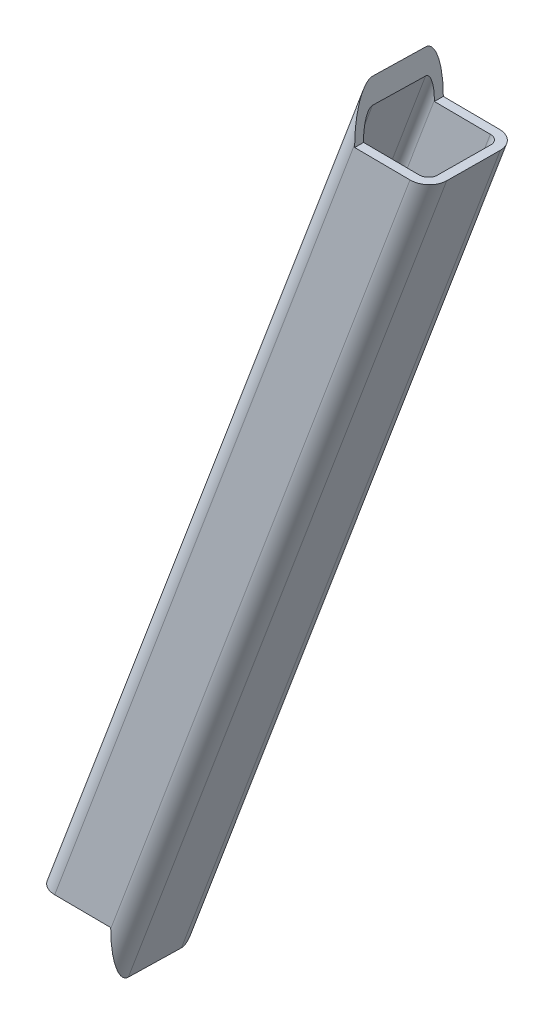
ISO-10303-21;
HEADER;
FILE_DESCRIPTION(('STEP AP214'),'2;1');
FILE_NAME('part.step','',(''),(''),'','','');
FILE_SCHEMA(('AUTOMOTIVE_DESIGN { 1 0 10303 214 1 1 1 1 }'));
ENDSEC;
DATA;
#1=APPLICATION_CONTEXT('core data for automotive mechanical design processes');
#2=APPLICATION_PROTOCOL_DEFINITION('international standard','automotive_design',2000,#1);
#3=PRODUCT_CONTEXT('',#1,'mechanical');
#4=PRODUCT('Part','Part','',(#3));
#5=PRODUCT_RELATED_PRODUCT_CATEGORY('part','',(#4));
#6=PRODUCT_DEFINITION_FORMATION('','',#4);
#7=PRODUCT_DEFINITION_CONTEXT('part definition',#1,'design');
#8=PRODUCT_DEFINITION('design','',#6,#7);
#9=PRODUCT_DEFINITION_SHAPE('','',#8);
#10=(LENGTH_UNIT() NAMED_UNIT(*) SI_UNIT(.MILLI.,.METRE.));
#11=(NAMED_UNIT(*) PLANE_ANGLE_UNIT() SI_UNIT($,.RADIAN.));
#12=(NAMED_UNIT(*) SI_UNIT($,.STERADIAN.) SOLID_ANGLE_UNIT());
#13=UNCERTAINTY_MEASURE_WITH_UNIT(LENGTH_MEASURE(1.E-05),#10,'distance_accuracy_value','');
#14=(GEOMETRIC_REPRESENTATION_CONTEXT(3) GLOBAL_UNCERTAINTY_ASSIGNED_CONTEXT((#13)) GLOBAL_UNIT_ASSIGNED_CONTEXT((#10,
#11,#12)) REPRESENTATION_CONTEXT('',''));
#15=CARTESIAN_POINT('',(0.,0.,0.));
#16=DIRECTION('',(0.,0.,1.));
#17=DIRECTION('',(1.,0.,0.));
#18=AXIS2_PLACEMENT_3D('',#15,#16,#17);
#19=CARTESIAN_POINT('',(219.454744066304,202.079470975136,-460.046190178042));
#20=DIRECTION('',(-0.00725504842421261,0.00272064315907973,0.999969980736004));
#21=DIRECTION('',(0.999973681595048,0.,0.00725507527493023));
#22=AXIS2_PLACEMENT_3D('',#19,#20,#21);
#23=PLANE('',#22);
#24=DIRECTION('',(0.999973681595048,0.,0.00725507527493023));
#25=VECTOR('',#24,1.);
#26=CARTESIAN_POINT('',(219.450952697221,10.,-459.523622298797));
#27=LINE('',#26,#25);
#28=CARTESIAN_POINT('',(147.424942450633,10.,-460.046190178042));
#29=VERTEX_POINT('',#28);
#30=CARTESIAN_POINT('',(160.,10.,-459.954954787765));
#31=VERTEX_POINT('',#30);
#32=EDGE_CURVE('E310',#29,#31,#27,.T.);
#33=ORIENTED_EDGE('',*,*,#32,.F.);
#34=DIRECTION('',(-0.351123441588392,-0.936329177569044,0.));
#35=VECTOR('',#34,1.);
#36=CARTESIAN_POINT('',(219.454744066304,202.079470975136,-460.046190178042));
#37=LINE('',#36,#35);
#38=CARTESIAN_POINT('',(215.,190.200153464978,-460.046190178042));
#39=VERTEX_POINT('',#38);
#40=EDGE_CURVE('E191',#39,#29,#37,.T.);
#41=ORIENTED_EDGE('',*,*,#40,.F.);
#42=DIRECTION('',(0.,0.999996298848739,-0.00272071476342261));
#43=VECTOR('',#42,1.);
#44=CARTESIAN_POINT('',(215.,202.079383040997,-460.078510292949));
#45=LINE('',#44,#43);
#46=CARTESIAN_POINT('',(215.,190.,-460.045645615539));
#47=VERTEX_POINT('',#46);
#48=EDGE_CURVE('E190',#47,#39,#45,.T.);
#49=ORIENTED_EDGE('',*,*,#48,.F.);
#50=DIRECTION('',(-0.999973681595048,0.,-0.00725507527493023));
#51=VECTOR('',#50,1.);
#52=CARTESIAN_POINT('',(219.454505635135,190.,-460.013326991269));
#53=LINE('',#52,#51);
#54=CARTESIAN_POINT('',(227.740563341519,190.,-459.953209436679));
#55=VERTEX_POINT('',#54);
#56=EDGE_CURVE('E188',#55,#47,#53,.T.);
#57=ORIENTED_EDGE('',*,*,#56,.F.);
#58=DIRECTION('',(-0.351123441588392,-0.936329177569044,0.));
#59=VECTOR('',#58,1.);
#60=CARTESIAN_POINT('',(230.69035690218,197.866116161683,-459.953209436679));
#61=LINE('',#60,#59);
#62=CARTESIAN_POINT('',(160.,9.35849775595168,-459.953209436679));
#63=VERTEX_POINT('',#62);
#64=EDGE_CURVE('E45',#55,#63,#61,.T.);
#65=ORIENTED_EDGE('',*,*,#64,.T.);
#66=DIRECTION('',(0.,-0.999996298848739,0.00272071476342261));
#67=VECTOR('',#66,1.);
#68=CARTESIAN_POINT('',(160.,202.078297371969,-460.47754698135));
#69=LINE('',#68,#67);
#70=EDGE_CURVE('E300',#31,#63,#69,.T.);
#71=ORIENTED_EDGE('',*,*,#70,.F.);
#72=EDGE_LOOP('',(#33,#41,#49,#57,#65,#71));
#73=FACE_BOUND('',#72,.T.);
#74=ADVANCED_FACE('F41',(#73),#23,.F.);
#75=CARTESIAN_POINT('',(230.661336708483,197.876998734319,-455.953329513735));
#76=DIRECTION('',(-0.351123441588392,-0.936329177569044,0.));
#77=DIRECTION('',(0.936329177569044,-0.351123441588392,0.));
#78=AXIS2_PLACEMENT_3D('',#75,#76,#77);
#79=CYLINDRICAL_SURFACE('',#78,3.99999999999994);
#80=CARTESIAN_POINT('',(160.,9.44676751169801,-455.953329513735));
#81=DIRECTION('',(-1.,0.,0.));
#82=DIRECTION('',(0.,-1.,0.));
#83=AXIS2_PLACEMENT_3D('',#80,#81,#82);
#84=ELLIPSE('',#83,11.3920049937565,3.99999999999994);
#85=CARTESIAN_POINT('',(160.,-1.94489550245314,-455.92233593328));
#86=VERTEX_POINT('',#85);
#87=EDGE_CURVE('E204',#63,#86,#84,.T.);
#88=ORIENTED_EDGE('',*,*,#87,.F.);
#89=ORIENTED_EDGE('',*,*,#64,.F.);
#90=CARTESIAN_POINT('',(227.707462183113,190.,-455.953329513735));
#91=DIRECTION('',(0.,1.,0.));
#92=DIRECTION('',(-1.,0.,0.));
#93=AXIS2_PLACEMENT_3D('',#90,#91,#92);
#94=ELLIPSE('',#93,4.27200187265871,3.99999999999994);
#95=CARTESIAN_POINT('',(231.97933581342,190.,-455.92233593328));
#96=VERTEX_POINT('',#95);
#97=EDGE_CURVE('E230',#96,#55,#94,.T.);
#98=ORIENTED_EDGE('',*,*,#97,.F.);
#99=DIRECTION('',(-0.351123441588392,-0.936329177569044,0.));
#100=VECTOR('',#99,1.);
#101=CARTESIAN_POINT('',(234.406540987108,196.472547129835,-455.92233593328));
#102=LINE('',#101,#100);
#103=EDGE_CURVE('E289',#96,#86,#102,.T.);
#104=ORIENTED_EDGE('',*,*,#103,.T.);
#105=EDGE_LOOP('',(#88,#89,#98,#104));
#106=FACE_BOUND('',#105,.T.);
#107=ADVANCED_FACE('F301',(#106),#79,.T.);
#108=CARTESIAN_POINT('',(234.319480406018,196.505194847743,-443.922696164448));
#109=DIRECTION('',(-0.936301069656275,0.351112901121104,-0.00774839511359569));
#110=DIRECTION('',(-0.351123441588392,-0.936329177569045,0.));
#111=AXIS2_PLACEMENT_3D('',#108,#109,#110);
#112=PLANE('',#111);
#113=DIRECTION('',(0.,0.0220627297921574,0.999756588352444));
#114=VECTOR('',#113,1.);
#115=CARTESIAN_POINT('',(160.,-1.58361676571628,-439.551252178588));
#116=LINE('',#115,#114);
#117=CARTESIAN_POINT('',(160.,-1.68008623497031,-443.922696164448));
#118=VERTEX_POINT('',#117);
#119=EDGE_CURVE('E304',#86,#118,#116,.T.);
#120=ORIENTED_EDGE('',*,*,#119,.F.);
#121=ORIENTED_EDGE('',*,*,#103,.F.);
#122=DIRECTION('',(0.00827525467579495,0.,-0.999965759493819));
#123=VECTOR('',#122,1.);
#124=CARTESIAN_POINT('',(231.880199391127,190.,-443.942882527263));
#125=LINE('',#124,#123);
#126=CARTESIAN_POINT('',(231.880032338114,190.,-443.922696164448));
#127=VERTEX_POINT('',#126);
#128=EDGE_CURVE('E228',#127,#96,#125,.T.);
#129=ORIENTED_EDGE('',*,*,#128,.F.);
#130=DIRECTION('',(-0.351123441588392,-0.936329177569044,0.));
#131=VECTOR('',#130,1.);
#132=CARTESIAN_POINT('',(234.319480406018,196.505194847743,-443.922696164448));
#133=LINE('',#132,#131);
#134=EDGE_CURVE('E287',#127,#118,#133,.T.);
#135=ORIENTED_EDGE('',*,*,#134,.T.);
#136=EDGE_LOOP('',(#120,#121,#129,#135));
#137=FACE_BOUND('',#136,.T.);
#138=ADVANCED_FACE('F354',(#137),#112,.F.);
#139=CARTESIAN_POINT('',(230.574276127392,197.909646452228,-443.953689744902));
#140=DIRECTION('',(-0.351123441588392,-0.936329177569044,0.));
#141=DIRECTION('',(0.936329177569044,-0.351123441588392,0.));
#142=AXIS2_PLACEMENT_3D('',#139,#140,#141);
#143=CYLINDRICAL_SURFACE('',#142,3.99999999999996);
#144=CARTESIAN_POINT('',(160.,9.71157677918114,-443.953689744902));
#145=DIRECTION('',(-1.,0.,0.));
#146=DIRECTION('',(0.,-1.,0.));
#147=AXIS2_PLACEMENT_3D('',#144,#145,#146);
#148=ELLIPSE('',#147,11.3920049937566,3.99999999999996);
#149=CARTESIAN_POINT('',(160.,9.79984653500873,-439.953809821958));
#150=VERTEX_POINT('',#149);
#151=EDGE_CURVE('E305',#118,#150,#148,.T.);
#152=ORIENTED_EDGE('',*,*,#151,.F.);
#153=ORIENTED_EDGE('',*,*,#134,.F.);
#154=CARTESIAN_POINT('',(227.608158707807,190.,-443.953689744902));
#155=DIRECTION('',(0.,1.,0.));
#156=DIRECTION('',(-1.,0.,0.));
#157=AXIS2_PLACEMENT_3D('',#154,#155,#156);
#158=ELLIPSE('',#157,4.27200187265872,3.99999999999996);
#159=CARTESIAN_POINT('',(227.575057549372,190.,-439.953809821958));
#160=VERTEX_POINT('',#159);
#161=EDGE_CURVE('E226',#160,#127,#158,.T.);
#162=ORIENTED_EDGE('',*,*,#161,.F.);
#163=DIRECTION('',(-0.351123441588392,-0.936329177569044,0.));
#164=VECTOR('',#163,1.);
#165=CARTESIAN_POINT('',(230.545255933696,197.920529024864,-439.953809821958));
#166=LINE('',#165,#164);
#167=EDGE_CURVE('E284',#160,#150,#166,.T.);
#168=ORIENTED_EDGE('',*,*,#167,.T.);
#169=EDGE_LOOP('',(#152,#153,#162,#168));
#170=FACE_BOUND('',#169,.T.);
#171=ADVANCED_FACE('F350',(#170),#143,.T.);
#172=CARTESIAN_POINT('',(230.545255933696,197.920529024864,-439.953809821958));
#173=DIRECTION('',(0.00725504842421261,-0.00272064315907973,-0.999969980736004));
#174=DIRECTION('',(-0.999973681595048,0.,-0.00725507527493023));
#175=AXIS2_PLACEMENT_3D('',#172,#173,#174);
#176=PLANE('',#175);
#177=DIRECTION('',(-0.999973681595048,0.,-0.00725507527493023));
#178=VECTOR('',#177,1.);
#179=CARTESIAN_POINT('',(230.541546656071,10.,-439.442556683762));
#180=LINE('',#179,#178);
#181=CARTESIAN_POINT('',(160.,10.,-439.954354384461));
#182=VERTEX_POINT('',#181);
#183=CARTESIAN_POINT('',(147.259436658451,10.,-440.046790563322));
#184=VERTEX_POINT('',#183);
#185=EDGE_CURVE('E255',#182,#184,#180,.T.);
#186=ORIENTED_EDGE('',*,*,#185,.F.);
#187=DIRECTION('',(0.,0.999996298848739,-0.00272071476342261));
#188=VECTOR('',#187,1.);
#189=CARTESIAN_POINT('',(160.,197.919136501239,-440.46563064578));
#190=LINE('',#189,#188);
#191=EDGE_CURVE('E256',#150,#182,#190,.T.);
#192=ORIENTED_EDGE('',*,*,#191,.F.);
#193=ORIENTED_EDGE('',*,*,#167,.F.);
#194=DIRECTION('',(0.999973681595048,0.,0.00725507527493023));
#195=VECTOR('',#194,1.);
#196=CARTESIAN_POINT('',(230.545099593985,190.,-439.932261376234));
#197=LINE('',#196,#195);
#198=CARTESIAN_POINT('',(215.,190.,-440.045045212236));
#199=VERTEX_POINT('',#198);
#200=EDGE_CURVE('E224',#199,#160,#197,.T.);
#201=ORIENTED_EDGE('',*,*,#200,.F.);
#202=DIRECTION('',(0.,-0.999996298848739,0.00272071476342261));
#203=VECTOR('',#202,1.);
#204=CARTESIAN_POINT('',(215.,197.920222170266,-440.066593957379));
#205=LINE('',#204,#203);
#206=CARTESIAN_POINT('',(215.,190.64150224413,-440.046790563322));
#207=VERTEX_POINT('',#206);
#208=EDGE_CURVE('E243',#207,#199,#205,.T.);
#209=ORIENTED_EDGE('',*,*,#208,.F.);
#210=DIRECTION('',(-0.351123441588392,-0.936329177569044,0.));
#211=VECTOR('',#210,1.);
#212=CARTESIAN_POINT('',(219.30964309782,202.133883838317,-440.046790563322));
#213=LINE('',#212,#211);
#214=EDGE_CURVE('E281',#207,#184,#213,.T.);
#215=ORIENTED_EDGE('',*,*,#214,.T.);
#216=EDGE_LOOP('',(#186,#192,#193,#201,#209,#215));
#217=FACE_BOUND('',#216,.T.);
#218=ADVANCED_FACE('F347',(#217),#176,.F.);
#219=CARTESIAN_POINT('',(219.338663291517,202.123001265681,-444.046670486265));
#220=DIRECTION('',(-0.351123441588392,-0.936329177569044,0.));
#221=DIRECTION('',(0.936329177569044,-0.351123441588392,0.));
#222=AXIS2_PLACEMENT_3D('',#219,#220,#221);
#223=CYLINDRICAL_SURFACE('',#222,3.99999999999994);
#224=CARTESIAN_POINT('',(147.292537816887,10.,-444.046670486265));
#225=DIRECTION('',(0.,-1.,0.));
#226=DIRECTION('',(-1.,0.,0.));
#227=AXIS2_PLACEMENT_3D('',#224,#225,#226);
#228=ELLIPSE('',#227,4.27200187265871,3.99999999999994);
#229=CARTESIAN_POINT('',(143.02066418658,10.,-444.07766406672));
#230=VERTEX_POINT('',#229);
#231=EDGE_CURVE('E323',#184,#230,#228,.T.);
#232=ORIENTED_EDGE('',*,*,#231,.F.);
#233=ORIENTED_EDGE('',*,*,#214,.F.);
#234=CARTESIAN_POINT('',(215.,190.553232488303,-444.046670486265));
#235=DIRECTION('',(1.,0.,0.));
#236=DIRECTION('',(0.,-1.,0.));
#237=AXIS2_PLACEMENT_3D('',#234,#235,#236);
#238=ELLIPSE('',#237,11.3920049937565,3.99999999999994);
#239=CARTESIAN_POINT('',(215.,201.944895502454,-444.07766406672));
#240=VERTEX_POINT('',#239);
#241=EDGE_CURVE('E246',#240,#207,#238,.T.);
#242=ORIENTED_EDGE('',*,*,#241,.F.);
#243=DIRECTION('',(-0.351123441588392,-0.936329177569044,0.));
#244=VECTOR('',#243,1.);
#245=CARTESIAN_POINT('',(215.593459012892,203.527452870166,-444.07766406672));
#246=LINE('',#245,#244);
#247=EDGE_CURVE('E278',#240,#230,#246,.T.);
#248=ORIENTED_EDGE('',*,*,#247,.T.);
#249=EDGE_LOOP('',(#232,#233,#242,#248));
#250=FACE_BOUND('',#249,.T.);
#251=ADVANCED_FACE('F480',(#250),#223,.T.);
#252=CARTESIAN_POINT('',(215.680519593982,203.494805152257,-456.077303835552));
#253=DIRECTION('',(0.936301069656275,-0.351112901121104,0.00774839511359569));
#254=DIRECTION('',(0.351123441588392,0.936329177569045,0.));
#255=AXIS2_PLACEMENT_3D('',#252,#253,#254);
#256=PLANE('',#255);
#257=DIRECTION('',(0.00827525467579495,0.,-0.999965759493819));
#258=VECTOR('',#257,1.);
#259=CARTESIAN_POINT('',(143.124936596869,10.,-456.677740322253));
#260=LINE('',#259,#258);
#261=CARTESIAN_POINT('',(143.119967661886,10.,-456.077303835552));
#262=VERTEX_POINT('',#261);
#263=EDGE_CURVE('E325',#230,#262,#260,.T.);
#264=ORIENTED_EDGE('',*,*,#263,.F.);
#265=ORIENTED_EDGE('',*,*,#247,.F.);
#266=DIRECTION('',(0.,0.0220627297921568,0.999756588352444));
#267=VECTOR('',#266,1.);
#268=CARTESIAN_POINT('',(215.,201.680969574893,-456.037275928062));
#269=LINE('',#268,#267);
#270=CARTESIAN_POINT('',(215.,201.680086234971,-456.077303835552));
#271=VERTEX_POINT('',#270);
#272=EDGE_CURVE('E248',#271,#240,#269,.T.);
#273=ORIENTED_EDGE('',*,*,#272,.F.);
#274=DIRECTION('',(-0.351123441588392,-0.936329177569044,0.));
#275=VECTOR('',#274,1.);
#276=CARTESIAN_POINT('',(215.680519593982,203.494805152257,-456.077303835552));
#277=LINE('',#276,#275);
#278=EDGE_CURVE('E275',#271,#262,#277,.T.);
#279=ORIENTED_EDGE('',*,*,#278,.T.);
#280=EDGE_LOOP('',(#264,#265,#273,#279));
#281=FACE_BOUND('',#280,.T.);
#282=ADVANCED_FACE('F470',(#281),#256,.F.);
#283=CARTESIAN_POINT('',(219.425723872607,202.090353547772,-456.046310255098));
#284=DIRECTION('',(-0.351123441588392,-0.936329177569044,0.));
#285=DIRECTION('',(0.936329177569044,-0.351123441588392,0.));
#286=AXIS2_PLACEMENT_3D('',#283,#284,#285);
#287=CYLINDRICAL_SURFACE('',#286,3.99999999999996);
#288=CARTESIAN_POINT('',(147.391841292193,10.,-456.046310255098));
#289=DIRECTION('',(0.,-1.,0.));
#290=DIRECTION('',(-1.,0.,0.));
#291=AXIS2_PLACEMENT_3D('',#288,#289,#290);
#292=ELLIPSE('',#291,4.27200187265872,3.99999999999996);
#293=EDGE_CURVE('E327',#262,#29,#292,.T.);
#294=ORIENTED_EDGE('',*,*,#293,.F.);
#295=ORIENTED_EDGE('',*,*,#278,.F.);
#296=CARTESIAN_POINT('',(215.,190.28842322082,-456.046310255098));
#297=DIRECTION('',(1.,0.,0.));
#298=DIRECTION('',(0.,-1.,0.));
#299=AXIS2_PLACEMENT_3D('',#296,#297,#298);
#300=ELLIPSE('',#299,11.3920049937566,3.99999999999996);
#301=EDGE_CURVE('E250',#39,#271,#300,.T.);
#302=ORIENTED_EDGE('',*,*,#301,.F.);
#303=ORIENTED_EDGE('',*,*,#40,.T.);
#304=EDGE_LOOP('',(#294,#295,#302,#303));
#305=FACE_BOUND('',#304,.T.);
#306=ADVANCED_FACE('F378',(#305),#287,.T.);
#307=CARTESIAN_POINT('',(215.,194.,-200.));
#308=DIRECTION('',(1.,0.,0.));
#309=DIRECTION('',(0.,0.,-1.));
#310=AXIS2_PLACEMENT_3D('',#307,#308,#309);
#311=PLANE('',#310);
#312=DIRECTION('',(0.,0.,-1.));
#313=VECTOR('',#312,1.);
#314=CARTESIAN_POINT('',(215.,190.,-200.));
#315=LINE('',#314,#313);
#316=CARTESIAN_POINT('',(215.,190.,-458.045585575209));
#317=VERTEX_POINT('',#316);
#318=EDGE_CURVE('E173',#317,#47,#315,.T.);
#319=ORIENTED_EDGE('',*,*,#318,.T.);
#320=ORIENTED_EDGE('',*,*,#48,.T.);
#321=ORIENTED_EDGE('',*,*,#301,.T.);
#322=ORIENTED_EDGE('',*,*,#272,.T.);
#323=ORIENTED_EDGE('',*,*,#241,.T.);
#324=ORIENTED_EDGE('',*,*,#208,.T.);
#325=CARTESIAN_POINT('',(215.,190.,-442.045105252566));
#326=VERTEX_POINT('',#325);
#327=EDGE_CURVE('E193',#199,#326,#315,.T.);
#328=ORIENTED_EDGE('',*,*,#327,.T.);
#329=DIRECTION('',(0.,-0.999996298848739,0.00272071476340962));
#330=VECTOR('',#329,1.);
#331=CARTESIAN_POINT('',(215.,197.914780597527,-442.066639192687));
#332=LINE('',#331,#330);
#333=CARTESIAN_POINT('',(215.,190.597367366133,-442.046730524793));
#334=VERTEX_POINT('',#333);
#335=EDGE_CURVE('E223',#334,#326,#332,.T.);
#336=ORIENTED_EDGE('',*,*,#335,.F.);
#337=CARTESIAN_POINT('',(215.,190.553232488303,-444.046670486265));
#338=DIRECTION('',(1.,0.,0.));
#339=DIRECTION('',(0.,-1.,0.));
#340=AXIS2_PLACEMENT_3D('',#337,#338,#339);
#341=ELLIPSE('',#340,5.69600249687857,2.00000000000008);
#342=CARTESIAN_POINT('',(215.,196.249063995378,-444.062167276493));
#343=VERTEX_POINT('',#342);
#344=EDGE_CURVE('E11',#343,#334,#341,.T.);
#345=ORIENTED_EDGE('',*,*,#344,.F.);
#346=DIRECTION('',(0.,0.0220627297921568,0.999756588352444));
#347=VECTOR('',#346,1.);
#348=CARTESIAN_POINT('',(215.,195.987568775534,-455.911633381768));
#349=LINE('',#348,#347);
#350=CARTESIAN_POINT('',(215.,195.984254727895,-456.061807045325));
#351=VERTEX_POINT('',#350);
#352=EDGE_CURVE('E235',#351,#343,#349,.T.);
#353=ORIENTED_EDGE('',*,*,#352,.F.);
#354=CARTESIAN_POINT('',(215.,190.28842322082,-456.046310255098));
#355=DIRECTION('',(1.,0.,0.));
#356=DIRECTION('',(0.,-1.,0.));
#357=AXIS2_PLACEMENT_3D('',#354,#355,#356);
#358=ELLIPSE('',#357,5.69600249687797,1.99999999999987);
#359=CARTESIAN_POINT('',(215.,190.244288342906,-458.04625021657));
#360=VERTEX_POINT('',#359);
#361=EDGE_CURVE('E176',#360,#351,#358,.T.);
#362=ORIENTED_EDGE('',*,*,#361,.F.);
#363=DIRECTION('',(0.,0.999996298848739,-0.00272071476340962));
#364=VECTOR('',#363,1.);
#365=CARTESIAN_POINT('',(215.,202.084824613736,-458.07846505764));
#366=LINE('',#365,#364);
#367=EDGE_CURVE('E170',#317,#360,#366,.T.);
#368=ORIENTED_EDGE('',*,*,#367,.F.);
#369=EDGE_LOOP('',(#319,#320,#321,#322,#323,#324,#328,#336,#345,#353,#362,#368));
#370=FACE_BOUND('',#369,.T.);
#371=ADVANCED_FACE('F172',(#370),#311,.T.);
#372=CARTESIAN_POINT('',(219.,190.,-200.));
#373=DIRECTION('',(0.,1.,0.));
#374=DIRECTION('',(0.,0.,1.));
#375=AXIS2_PLACEMENT_3D('',#372,#373,#374);
#376=PLANE('',#375);
#377=CARTESIAN_POINT('',(227.707462183113,190.,-455.953329513735));
#378=DIRECTION('',(0.,1.,0.));
#379=DIRECTION('',(-1.,0.,0.));
#380=AXIS2_PLACEMENT_3D('',#377,#378,#379);
#381=ELLIPSE('',#380,2.13600093632947,2.00000000000008);
#382=CARTESIAN_POINT('',(229.843398998267,190.,-455.937832723508));
#383=VERTEX_POINT('',#382);
#384=CARTESIAN_POINT('',(227.724012762331,190.,-457.953269475206));
#385=VERTEX_POINT('',#384);
#386=EDGE_CURVE('E206',#383,#385,#381,.T.);
#387=ORIENTED_EDGE('',*,*,#386,.F.);
#388=DIRECTION('',(0.00827525467579495,0.,-0.999965759493819));
#389=VECTOR('',#388,1.);
#390=CARTESIAN_POINT('',(229.74428060909,190.,-443.960558404383));
#391=LINE('',#390,#389);
#392=CARTESIAN_POINT('',(229.74409552296,190.,-443.938192954676));
#393=VERTEX_POINT('',#392);
#394=EDGE_CURVE('E210',#393,#383,#391,.T.);
#395=ORIENTED_EDGE('',*,*,#394,.F.);
#396=CARTESIAN_POINT('',(227.608158707807,190.,-443.953689744902));
#397=DIRECTION('',(0.,1.,0.));
#398=DIRECTION('',(-1.,0.,0.));
#399=AXIS2_PLACEMENT_3D('',#396,#397,#398);
#400=ELLIPSE('',#399,2.13600093632924,1.99999999999987);
#401=CARTESIAN_POINT('',(227.591608128585,190.,-441.953749783431));
#402=VERTEX_POINT('',#401);
#403=EDGE_CURVE('E214',#402,#393,#400,.T.);
#404=ORIENTED_EDGE('',*,*,#403,.F.);
#405=DIRECTION('',(0.999973681595049,0.,0.00725507527489559));
#406=VECTOR('',#405,1.);
#407=CARTESIAN_POINT('',(230.559609798237,190.,-441.93221614117));
#408=LINE('',#407,#406);
#409=EDGE_CURVE('E219',#326,#402,#408,.T.);
#410=ORIENTED_EDGE('',*,*,#409,.F.);
#411=ORIENTED_EDGE('',*,*,#327,.F.);
#412=ORIENTED_EDGE('',*,*,#200,.T.);
#413=ORIENTED_EDGE('',*,*,#161,.T.);
#414=ORIENTED_EDGE('',*,*,#128,.T.);
#415=ORIENTED_EDGE('',*,*,#97,.T.);
#416=ORIENTED_EDGE('',*,*,#56,.T.);
#417=ORIENTED_EDGE('',*,*,#318,.F.);
#418=DIRECTION('',(-0.999973681595049,0.,-0.00725507527489559));
#419=VECTOR('',#418,1.);
#420=CARTESIAN_POINT('',(219.439995430884,190.,-458.013372226333));
#421=LINE('',#420,#419);
#422=EDGE_CURVE('E182',#385,#317,#421,.T.);
#423=ORIENTED_EDGE('',*,*,#422,.F.);
#424=EDGE_LOOP('',(#387,#395,#404,#410,#411,#412,#413,#414,#415,#416,#417,#423));
#425=FACE_BOUND('',#424,.T.);
#426=ADVANCED_FACE('F185',(#425),#376,.T.);
#427=CARTESIAN_POINT('',(160.,-6.00000000000001,-450.));
#428=DIRECTION('',(-1.,0.,0.));
#429=DIRECTION('',(0.,0.,1.));
#430=AXIS2_PLACEMENT_3D('',#427,#428,#429);
#431=PLANE('',#430);
#432=DIRECTION('',(0.,0.,1.));
#433=VECTOR('',#432,1.);
#434=CARTESIAN_POINT('',(160.,10.,-450.));
#435=LINE('',#434,#433);
#436=CARTESIAN_POINT('',(160.,10.,-457.954894747434));
#437=VERTEX_POINT('',#436);
#438=EDGE_CURVE('E257',#31,#437,#435,.T.);
#439=ORIENTED_EDGE('',*,*,#438,.F.);
#440=ORIENTED_EDGE('',*,*,#70,.T.);
#441=ORIENTED_EDGE('',*,*,#87,.T.);
#442=ORIENTED_EDGE('',*,*,#119,.T.);
#443=ORIENTED_EDGE('',*,*,#151,.T.);
#444=ORIENTED_EDGE('',*,*,#191,.T.);
#445=CARTESIAN_POINT('',(160.,10.,-441.954414424792));
#446=VERTEX_POINT('',#445);
#447=EDGE_CURVE('E252',#446,#182,#435,.T.);
#448=ORIENTED_EDGE('',*,*,#447,.F.);
#449=DIRECTION('',(0.,0.999996298848739,-0.00272071476340962));
#450=VECTOR('',#449,1.);
#451=CARTESIAN_POINT('',(160.,197.913694928499,-442.465675881087));
#452=LINE('',#451,#450);
#453=CARTESIAN_POINT('',(160.,9.75571165710054,-441.953749783431));
#454=VERTEX_POINT('',#453);
#455=EDGE_CURVE('E321',#454,#446,#452,.T.);
#456=ORIENTED_EDGE('',*,*,#455,.F.);
#457=CARTESIAN_POINT('',(160.,9.71157677918114,-443.953689744902));
#458=DIRECTION('',(-1.,0.,0.));
#459=DIRECTION('',(0.,-1.,0.));
#460=AXIS2_PLACEMENT_3D('',#457,#458,#459);
#461=ELLIPSE('',#460,5.69600249687797,1.99999999999987);
#462=CARTESIAN_POINT('',(160.,4.01574527210549,-443.938192954676));
#463=VERTEX_POINT('',#462);
#464=EDGE_CURVE('E218',#463,#454,#461,.T.);
#465=ORIENTED_EDGE('',*,*,#464,.F.);
#466=DIRECTION('',(0.,0.0220627297921574,0.999756588352444));
#467=VECTOR('',#466,1.);
#468=CARTESIAN_POINT('',(160.,4.10978403364309,-439.676894724882));
#469=LINE('',#468,#467);
#470=CARTESIAN_POINT('',(160.,3.75093600462243,-455.937832723508));
#471=VERTEX_POINT('',#470);
#472=EDGE_CURVE('E213',#471,#463,#469,.T.);
#473=ORIENTED_EDGE('',*,*,#472,.F.);
#474=CARTESIAN_POINT('',(160.,9.44676751169801,-455.953329513735));
#475=DIRECTION('',(-1.,0.,0.));
#476=DIRECTION('',(0.,-1.,0.));
#477=AXIS2_PLACEMENT_3D('',#474,#475,#476);
#478=ELLIPSE('',#477,5.69600249687857,2.00000000000008);
#479=CARTESIAN_POINT('',(160.,9.40263263378419,-457.953269475206));
#480=VERTEX_POINT('',#479);
#481=EDGE_CURVE('E209',#480,#471,#478,.T.);
#482=ORIENTED_EDGE('',*,*,#481,.F.);
#483=DIRECTION('',(0.,-0.999996298848739,0.00272071476340962));
#484=VECTOR('',#483,1.);
#485=CARTESIAN_POINT('',(160.,202.083738944709,-458.47750174604));
#486=LINE('',#485,#484);
#487=EDGE_CURVE('E199',#437,#480,#486,.T.);
#488=ORIENTED_EDGE('',*,*,#487,.F.);
#489=EDGE_LOOP('',(#439,#440,#441,#442,#443,#444,#448,#456,#465,#473,#482,#488));
#490=FACE_BOUND('',#489,.T.);
#491=ADVANCED_FACE('F340',(#490),#431,.T.);
#492=CARTESIAN_POINT('',(144.,10.,-450.));
#493=DIRECTION('',(0.,-1.,0.));
#494=DIRECTION('',(0.,0.,-1.));
#495=AXIS2_PLACEMENT_3D('',#492,#493,#494);
#496=PLANE('',#495);
#497=CARTESIAN_POINT('',(147.391841292193,10.,-456.046310255098));
#498=DIRECTION('',(0.,-1.,0.));
#499=DIRECTION('',(-1.,0.,0.));
#500=AXIS2_PLACEMENT_3D('',#497,#498,#499);
#501=ELLIPSE('',#500,2.13600093632924,1.99999999999987);
#502=CARTESIAN_POINT('',(145.255904477039,10.,-456.061807045325));
#503=VERTEX_POINT('',#502);
#504=CARTESIAN_POINT('',(147.40839187141,10.,-458.04625021657));
#505=VERTEX_POINT('',#504);
#506=EDGE_CURVE('E234',#503,#505,#501,.T.);
#507=ORIENTED_EDGE('',*,*,#506,.F.);
#508=DIRECTION('',(0.00827525467579495,0.,-0.999965759493819));
#509=VECTOR('',#508,1.);
#510=CARTESIAN_POINT('',(145.260855378906,10.,-456.660064445134));
#511=LINE('',#510,#509);
#512=CARTESIAN_POINT('',(145.156601001733,10.,-444.062167276493));
#513=VERTEX_POINT('',#512);
#514=EDGE_CURVE('E238',#513,#503,#511,.T.);
#515=ORIENTED_EDGE('',*,*,#514,.F.);
#516=CARTESIAN_POINT('',(147.292537816887,10.,-444.046670486265));
#517=DIRECTION('',(0.,-1.,0.));
#518=DIRECTION('',(-1.,0.,0.));
#519=AXIS2_PLACEMENT_3D('',#516,#517,#518);
#520=ELLIPSE('',#519,2.13600093632947,2.00000000000008);
#521=CARTESIAN_POINT('',(147.275987237698,10.,-442.046730524793));
#522=VERTEX_POINT('',#521);
#523=EDGE_CURVE('E51',#522,#513,#520,.T.);
#524=ORIENTED_EDGE('',*,*,#523,.F.);
#525=DIRECTION('',(-0.999973681595049,0.,-0.00725507527489559));
#526=VECTOR('',#525,1.);
#527=CARTESIAN_POINT('',(230.556056860323,10.,-441.4425114487));
#528=LINE('',#527,#526);
#529=EDGE_CURVE('E242',#446,#522,#528,.T.);
#530=ORIENTED_EDGE('',*,*,#529,.F.);
#531=ORIENTED_EDGE('',*,*,#447,.T.);
#532=ORIENTED_EDGE('',*,*,#185,.T.);
#533=ORIENTED_EDGE('',*,*,#231,.T.);
#534=ORIENTED_EDGE('',*,*,#263,.T.);
#535=ORIENTED_EDGE('',*,*,#293,.T.);
#536=ORIENTED_EDGE('',*,*,#32,.T.);
#537=ORIENTED_EDGE('',*,*,#438,.T.);
#538=DIRECTION('',(0.999973681595049,0.,0.00725507527489559));
#539=VECTOR('',#538,1.);
#540=CARTESIAN_POINT('',(219.43644249297,10.,-457.523667533864));
#541=LINE('',#540,#539);
#542=EDGE_CURVE('E60',#505,#437,#541,.T.);
#543=ORIENTED_EDGE('',*,*,#542,.F.);
#544=EDGE_LOOP('',(#507,#515,#524,#530,#531,#532,#533,#534,#535,#536,#537,#543));
#545=FACE_BOUND('',#544,.T.);
#546=ADVANCED_FACE('F372',(#545),#496,.T.);
#547=CARTESIAN_POINT('',(230.559766030544,197.915087738546,-441.953749783431));
#548=DIRECTION('',(0.00725504842417797,-0.00272064315906674,-0.999969980736004));
#549=DIRECTION('',(-0.999973681595049,0.,-0.00725507527489559));
#550=AXIS2_PLACEMENT_3D('',#547,#548,#549);
#551=PLANE('',#550);
#552=ORIENTED_EDGE('',*,*,#455,.T.);
#553=ORIENTED_EDGE('',*,*,#529,.T.);
#554=DIRECTION('',(-0.351123441588392,-0.936329177569044,0.));
#555=VECTOR('',#554,1.);
#556=CARTESIAN_POINT('',(219.324153194669,202.128442551999,-442.046730524793));
#557=LINE('',#556,#555);
#558=EDGE_CURVE('E237',#334,#522,#557,.T.);
#559=ORIENTED_EDGE('',*,*,#558,.F.);
#560=ORIENTED_EDGE('',*,*,#335,.T.);
#561=ORIENTED_EDGE('',*,*,#409,.T.);
#562=DIRECTION('',(-0.351123441588392,-0.936329177569044,0.));
#563=VECTOR('',#562,1.);
#564=CARTESIAN_POINT('',(230.559766030544,197.915087738546,-441.953749783431));
#565=LINE('',#564,#563);
#566=EDGE_CURVE('E222',#402,#454,#565,.T.);
#567=ORIENTED_EDGE('',*,*,#566,.T.);
#568=EDGE_LOOP('',(#552,#553,#559,#560,#561,#567));
#569=FACE_BOUND('',#568,.T.);
#570=ADVANCED_FACE('F375',(#569),#551,.T.);
#571=CARTESIAN_POINT('',(230.574276127392,197.909646452228,-443.953689744902));
#572=DIRECTION('',(-0.351123441588392,-0.936329177569044,0.));
#573=DIRECTION('',(0.936329177569044,-0.351123441588392,0.));
#574=AXIS2_PLACEMENT_3D('',#571,#572,#573);
#575=CYLINDRICAL_SURFACE('',#574,1.99999999999987);
#576=DIRECTION('',(-0.351123441588392,-0.936329177569044,0.));
#577=VECTOR('',#576,1.);
#578=CARTESIAN_POINT('',(232.446878266705,197.207420649986,-443.938192954676));
#579=LINE('',#578,#577);
#580=EDGE_CURVE('E268',#393,#463,#579,.T.);
#581=ORIENTED_EDGE('',*,*,#580,.T.);
#582=ORIENTED_EDGE('',*,*,#464,.T.);
#583=ORIENTED_EDGE('',*,*,#566,.F.);
#584=ORIENTED_EDGE('',*,*,#403,.T.);
#585=EDGE_LOOP('',(#581,#582,#583,#584));
#586=FACE_BOUND('',#585,.T.);
#587=ADVANCED_FACE('F404',(#586),#575,.F.);
#588=CARTESIAN_POINT('',(232.446878266705,197.207420649986,-443.938192954676));
#589=DIRECTION('',(-0.936301069656275,0.351112901121104,-0.00774839511359569));
#590=DIRECTION('',(-0.351123441588392,-0.936329177569045,0.));
#591=AXIS2_PLACEMENT_3D('',#588,#589,#590);
#592=PLANE('',#591);
#593=DIRECTION('',(-0.351123441588392,-0.936329177569044,0.));
#594=VECTOR('',#593,1.);
#595=CARTESIAN_POINT('',(232.533938847795,197.174772932077,-455.937832723508));
#596=LINE('',#595,#594);
#597=EDGE_CURVE('E217',#383,#471,#596,.T.);
#598=ORIENTED_EDGE('',*,*,#597,.T.);
#599=ORIENTED_EDGE('',*,*,#472,.T.);
#600=ORIENTED_EDGE('',*,*,#580,.F.);
#601=ORIENTED_EDGE('',*,*,#394,.T.);
#602=EDGE_LOOP('',(#598,#599,#600,#601));
#603=FACE_BOUND('',#602,.T.);
#604=ADVANCED_FACE('F413',(#603),#592,.T.);
#605=CARTESIAN_POINT('',(230.661336708483,197.876998734319,-455.953329513735));
#606=DIRECTION('',(-0.351123441588392,-0.936329177569044,0.));
#607=DIRECTION('',(0.936329177569044,-0.351123441588392,0.));
#608=AXIS2_PLACEMENT_3D('',#605,#606,#607);
#609=CYLINDRICAL_SURFACE('',#608,2.00000000000008);
#610=DIRECTION('',(-0.351123441588392,-0.936329177569044,0.));
#611=VECTOR('',#610,1.);
#612=CARTESIAN_POINT('',(230.675846805331,197.871557448001,-457.953269475206));
#613=LINE('',#612,#611);
#614=EDGE_CURVE('E198',#385,#480,#613,.T.);
#615=ORIENTED_EDGE('',*,*,#614,.T.);
#616=ORIENTED_EDGE('',*,*,#481,.T.);
#617=ORIENTED_EDGE('',*,*,#597,.F.);
#618=ORIENTED_EDGE('',*,*,#386,.T.);
#619=EDGE_LOOP('',(#615,#616,#617,#618));
#620=FACE_BOUND('',#619,.T.);
#621=ADVANCED_FACE('F422',(#620),#609,.F.);
#622=CARTESIAN_POINT('',(219.440233969456,202.084912261454,-458.04625021657));
#623=DIRECTION('',(-0.00725504842417797,0.00272064315906674,0.999969980736004));
#624=DIRECTION('',(0.999973681595049,0.,0.00725507527489559));
#625=AXIS2_PLACEMENT_3D('',#622,#623,#624);
#626=PLANE('',#625);
#627=DIRECTION('',(-0.351123441588392,-0.936329177569044,0.));
#628=VECTOR('',#627,1.);
#629=CARTESIAN_POINT('',(219.440233969456,202.084912261454,-458.04625021657));
#630=LINE('',#629,#628);
#631=EDGE_CURVE('E208',#360,#505,#630,.T.);
#632=ORIENTED_EDGE('',*,*,#631,.T.);
#633=ORIENTED_EDGE('',*,*,#542,.T.);
#634=ORIENTED_EDGE('',*,*,#487,.T.);
#635=ORIENTED_EDGE('',*,*,#614,.F.);
#636=ORIENTED_EDGE('',*,*,#422,.T.);
#637=ORIENTED_EDGE('',*,*,#367,.T.);
#638=EDGE_LOOP('',(#632,#633,#634,#635,#636,#637));
#639=FACE_BOUND('',#638,.T.);
#640=ADVANCED_FACE('F195',(#639),#626,.T.);
#641=CARTESIAN_POINT('',(219.425723872607,202.090353547772,-456.046310255098));
#642=DIRECTION('',(-0.351123441588392,-0.936329177569044,0.));
#643=DIRECTION('',(0.936329177569044,-0.351123441588392,0.));
#644=AXIS2_PLACEMENT_3D('',#641,#642,#643);
#645=CYLINDRICAL_SURFACE('',#644,1.99999999999987);
#646=DIRECTION('',(-0.351123441588392,-0.936329177569044,0.));
#647=VECTOR('',#646,1.);
#648=CARTESIAN_POINT('',(217.553121733295,202.792579350014,-456.061807045325));
#649=LINE('',#648,#647);
#650=EDGE_CURVE('E181',#351,#503,#649,.T.);
#651=ORIENTED_EDGE('',*,*,#650,.T.);
#652=ORIENTED_EDGE('',*,*,#506,.T.);
#653=ORIENTED_EDGE('',*,*,#631,.F.);
#654=ORIENTED_EDGE('',*,*,#361,.T.);
#655=EDGE_LOOP('',(#651,#652,#653,#654));
#656=FACE_BOUND('',#655,.T.);
#657=ADVANCED_FACE('F439',(#656),#645,.F.);
#658=CARTESIAN_POINT('',(217.553121733295,202.792579350014,-456.061807045325));
#659=DIRECTION('',(0.936301069656275,-0.351112901121104,0.00774839511359569));
#660=DIRECTION('',(0.351123441588392,0.936329177569045,0.));
#661=AXIS2_PLACEMENT_3D('',#658,#659,#660);
#662=PLANE('',#661);
#663=DIRECTION('',(-0.351123441588392,-0.936329177569044,0.));
#664=VECTOR('',#663,1.);
#665=CARTESIAN_POINT('',(217.466061152205,202.825227067923,-444.062167276493));
#666=LINE('',#665,#664);
#667=EDGE_CURVE('E233',#343,#513,#666,.T.);
#668=ORIENTED_EDGE('',*,*,#667,.T.);
#669=ORIENTED_EDGE('',*,*,#514,.T.);
#670=ORIENTED_EDGE('',*,*,#650,.F.);
#671=ORIENTED_EDGE('',*,*,#352,.T.);
#672=EDGE_LOOP('',(#668,#669,#670,#671));
#673=FACE_BOUND('',#672,.T.);
#674=ADVANCED_FACE('F447',(#673),#662,.T.);
#675=CARTESIAN_POINT('',(219.338663291517,202.123001265681,-444.046670486265));
#676=DIRECTION('',(-0.351123441588392,-0.936329177569044,0.));
#677=DIRECTION('',(0.936329177569044,-0.351123441588392,0.));
#678=AXIS2_PLACEMENT_3D('',#675,#676,#677);
#679=CYLINDRICAL_SURFACE('',#678,2.00000000000008);
#680=ORIENTED_EDGE('',*,*,#558,.T.);
#681=ORIENTED_EDGE('',*,*,#523,.T.);
#682=ORIENTED_EDGE('',*,*,#667,.F.);
#683=ORIENTED_EDGE('',*,*,#344,.T.);
#684=EDGE_LOOP('',(#680,#681,#682,#683));
#685=FACE_BOUND('',#684,.T.);
#686=ADVANCED_FACE('F43',(#685),#679,.F.);
#687=CLOSED_SHELL('',(#74,#107,#138,#171,#218,#251,#282,#306,#371,#426,#491,#546,#570,#587,#604,
#621,#640,#657,#674,#686));
#688=MANIFOLD_SOLID_BREP('B2',#687);
#689=ADVANCED_BREP_SHAPE_REPRESENTATION('',(#18,#688),#14);
#690=SHAPE_DEFINITION_REPRESENTATION(#9,#689);
ENDSEC;
END-ISO-10303-21;
